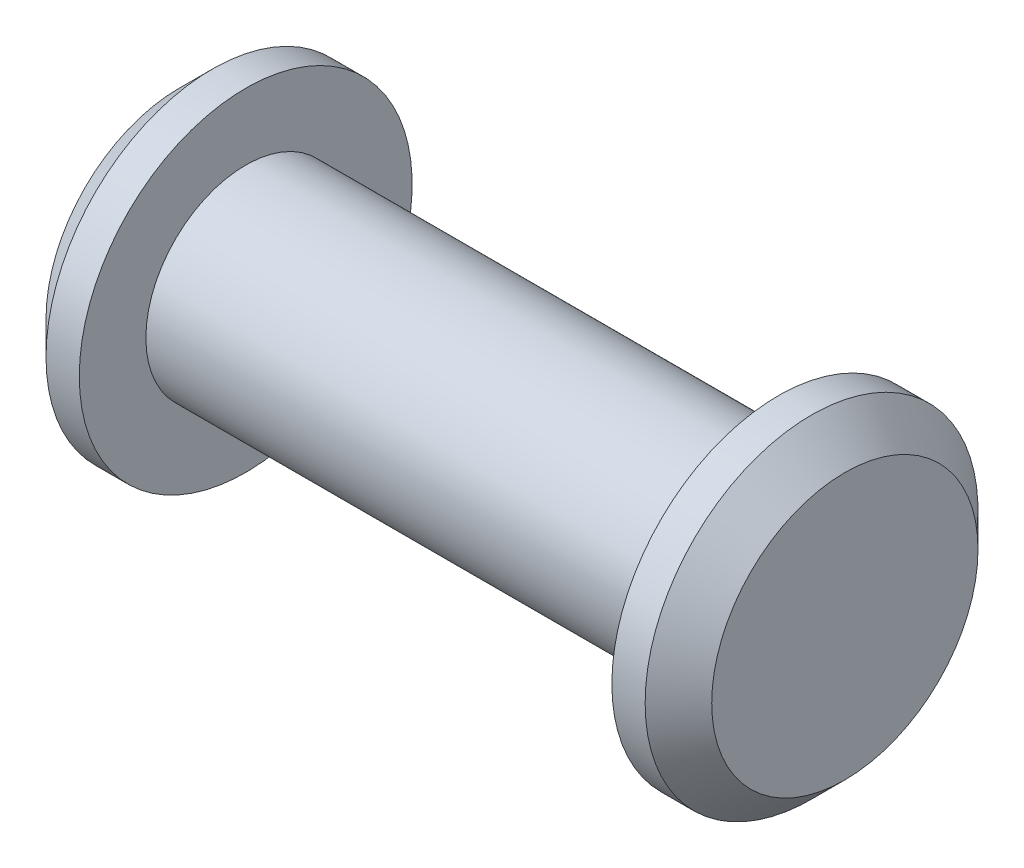
ISO-10303-21;
HEADER;
FILE_DESCRIPTION(('STEP AP214'),'2;1');
FILE_NAME('part.step','',(''),(''),'','','');
FILE_SCHEMA(('AUTOMOTIVE_DESIGN { 1 0 10303 214 1 1 1 1 }'));
ENDSEC;
DATA;
#1=APPLICATION_CONTEXT('core data for automotive mechanical design processes');
#2=APPLICATION_PROTOCOL_DEFINITION('international standard','automotive_design',2000,#1);
#3=PRODUCT_CONTEXT('',#1,'mechanical');
#4=PRODUCT('Part','Part','',(#3));
#5=PRODUCT_RELATED_PRODUCT_CATEGORY('part','',(#4));
#6=PRODUCT_DEFINITION_FORMATION('','',#4);
#7=PRODUCT_DEFINITION_CONTEXT('part definition',#1,'design');
#8=PRODUCT_DEFINITION('design','',#6,#7);
#9=PRODUCT_DEFINITION_SHAPE('','',#8);
#10=(LENGTH_UNIT() NAMED_UNIT(*) SI_UNIT(.MILLI.,.METRE.));
#11=(NAMED_UNIT(*) PLANE_ANGLE_UNIT() SI_UNIT($,.RADIAN.));
#12=(NAMED_UNIT(*) SI_UNIT($,.STERADIAN.) SOLID_ANGLE_UNIT());
#13=UNCERTAINTY_MEASURE_WITH_UNIT(LENGTH_MEASURE(1.E-05),#10,'distance_accuracy_value','');
#14=(GEOMETRIC_REPRESENTATION_CONTEXT(3) GLOBAL_UNCERTAINTY_ASSIGNED_CONTEXT((#13)) GLOBAL_UNIT_ASSIGNED_CONTEXT((#10,
#11,#12)) REPRESENTATION_CONTEXT('',''));
#15=CARTESIAN_POINT('',(0.,0.,0.));
#16=DIRECTION('',(0.,0.,1.));
#17=DIRECTION('',(1.,0.,0.));
#18=AXIS2_PLACEMENT_3D('',#15,#16,#17);
#19=CARTESIAN_POINT('',(-20.,0.,0.));
#20=DIRECTION('',(1.,0.,0.));
#21=DIRECTION('',(0.,0.,-1.));
#22=AXIS2_PLACEMENT_3D('',#19,#20,#21);
#23=PLANE('',#22);
#24=CARTESIAN_POINT('',(-20.,0.,0.));
#25=DIRECTION('',(-1.,0.,0.));
#26=DIRECTION('',(0.,0.,1.));
#27=AXIS2_PLACEMENT_3D('',#24,#25,#26);
#28=CIRCLE('',#27,8.);
#29=CARTESIAN_POINT('',(-20.,0.,8.));
#30=VERTEX_POINT('',#29);
#31=EDGE_CURVE('E10',#30,#30,#28,.T.);
#32=ORIENTED_EDGE('',*,*,#31,.T.);
#33=EDGE_LOOP('',(#32));
#34=FACE_BOUND('',#33,.T.);
#35=ADVANCED_FACE('F41',(#34),#23,.F.);
#36=CARTESIAN_POINT('',(-18.,0.,0.));
#37=DIRECTION('',(1.,0.,0.));
#38=DIRECTION('',(0.,0.,-1.));
#39=AXIS2_PLACEMENT_3D('',#36,#37,#38);
#40=CONICAL_SURFACE('',#39,10.,0.785398163397449);
#41=ORIENTED_EDGE('',*,*,#31,.F.);
#42=EDGE_LOOP('',(#41));
#43=FACE_BOUND('',#42,.T.);
#44=CARTESIAN_POINT('',(-18.,0.,0.));
#45=DIRECTION('',(-1.,0.,0.));
#46=DIRECTION('',(0.,0.,1.));
#47=AXIS2_PLACEMENT_3D('',#44,#45,#46);
#48=CIRCLE('',#47,10.);
#49=CARTESIAN_POINT('',(-18.,0.,10.));
#50=VERTEX_POINT('',#49);
#51=EDGE_CURVE('E47',#50,#50,#48,.T.);
#52=ORIENTED_EDGE('',*,*,#51,.T.);
#53=EDGE_LOOP('',(#52));
#54=FACE_BOUND('',#53,.T.);
#55=ADVANCED_FACE('F85',(#43,#54),#40,.T.);
#56=CARTESIAN_POINT('',(0.,0.,0.));
#57=DIRECTION('',(-1.,0.,0.));
#58=DIRECTION('',(0.,0.,1.));
#59=AXIS2_PLACEMENT_3D('',#56,#57,#58);
#60=CYLINDRICAL_SURFACE('',#59,10.);
#61=ORIENTED_EDGE('',*,*,#51,.F.);
#62=EDGE_LOOP('',(#61));
#63=FACE_BOUND('',#62,.T.);
#64=CARTESIAN_POINT('',(-16.,0.,0.));
#65=DIRECTION('',(-1.,0.,0.));
#66=DIRECTION('',(0.,0.,1.));
#67=AXIS2_PLACEMENT_3D('',#64,#65,#66);
#68=CIRCLE('',#67,10.);
#69=CARTESIAN_POINT('',(-16.,0.,10.));
#70=VERTEX_POINT('',#69);
#71=EDGE_CURVE('E51',#70,#70,#68,.T.);
#72=ORIENTED_EDGE('',*,*,#71,.T.);
#73=EDGE_LOOP('',(#72));
#74=FACE_BOUND('',#73,.T.);
#75=ADVANCED_FACE('F89',(#63,#74),#60,.T.);
#76=CARTESIAN_POINT('',(-16.,10.,0.));
#77=DIRECTION('',(-1.,0.,0.));
#78=DIRECTION('',(0.,0.,1.));
#79=AXIS2_PLACEMENT_3D('',#76,#77,#78);
#80=PLANE('',#79);
#81=ORIENTED_EDGE('',*,*,#71,.F.);
#82=EDGE_LOOP('',(#81));
#83=FACE_BOUND('',#82,.T.);
#84=CARTESIAN_POINT('',(-16.,0.,0.));
#85=DIRECTION('',(-1.,0.,0.));
#86=DIRECTION('',(0.,0.,1.));
#87=AXIS2_PLACEMENT_3D('',#84,#85,#86);
#88=CIRCLE('',#87,6.);
#89=CARTESIAN_POINT('',(-16.,0.,6.));
#90=VERTEX_POINT('',#89);
#91=EDGE_CURVE('E55',#90,#90,#88,.T.);
#92=ORIENTED_EDGE('',*,*,#91,.T.);
#93=EDGE_LOOP('',(#92));
#94=FACE_BOUND('',#93,.T.);
#95=ADVANCED_FACE('F94',(#83,#94),#80,.F.);
#96=CARTESIAN_POINT('',(0.,0.,0.));
#97=DIRECTION('',(-1.,0.,0.));
#98=DIRECTION('',(0.,0.,1.));
#99=AXIS2_PLACEMENT_3D('',#96,#97,#98);
#100=CYLINDRICAL_SURFACE('',#99,6.);
#101=ORIENTED_EDGE('',*,*,#91,.F.);
#102=EDGE_LOOP('',(#101));
#103=FACE_BOUND('',#102,.T.);
#104=CARTESIAN_POINT('',(16.,0.,0.));
#105=DIRECTION('',(-1.,0.,0.));
#106=DIRECTION('',(0.,0.,1.));
#107=AXIS2_PLACEMENT_3D('',#104,#105,#106);
#108=CIRCLE('',#107,6.);
#109=CARTESIAN_POINT('',(16.,0.,6.));
#110=VERTEX_POINT('',#109);
#111=EDGE_CURVE('E60',#110,#110,#108,.T.);
#112=ORIENTED_EDGE('',*,*,#111,.T.);
#113=EDGE_LOOP('',(#112));
#114=FACE_BOUND('',#113,.T.);
#115=ADVANCED_FACE('F100',(#103,#114),#100,.T.);
#116=CARTESIAN_POINT('',(16.,6.,0.));
#117=DIRECTION('',(1.,0.,0.));
#118=DIRECTION('',(0.,0.,-1.));
#119=AXIS2_PLACEMENT_3D('',#116,#117,#118);
#120=PLANE('',#119);
#121=ORIENTED_EDGE('',*,*,#111,.F.);
#122=EDGE_LOOP('',(#121));
#123=FACE_BOUND('',#122,.T.);
#124=CARTESIAN_POINT('',(16.,0.,0.));
#125=DIRECTION('',(-1.,0.,0.));
#126=DIRECTION('',(0.,0.,1.));
#127=AXIS2_PLACEMENT_3D('',#124,#125,#126);
#128=CIRCLE('',#127,10.);
#129=CARTESIAN_POINT('',(16.,0.,10.));
#130=VERTEX_POINT('',#129);
#131=EDGE_CURVE('E63',#130,#130,#128,.T.);
#132=ORIENTED_EDGE('',*,*,#131,.T.);
#133=EDGE_LOOP('',(#132));
#134=FACE_BOUND('',#133,.T.);
#135=ADVANCED_FACE('F104',(#123,#134),#120,.F.);
#136=CARTESIAN_POINT('',(0.,0.,0.));
#137=DIRECTION('',(-1.,0.,0.));
#138=DIRECTION('',(0.,0.,1.));
#139=AXIS2_PLACEMENT_3D('',#136,#137,#138);
#140=CYLINDRICAL_SURFACE('',#139,10.);
#141=ORIENTED_EDGE('',*,*,#131,.F.);
#142=EDGE_LOOP('',(#141));
#143=FACE_BOUND('',#142,.T.);
#144=CARTESIAN_POINT('',(18.,0.,0.));
#145=DIRECTION('',(-1.,0.,0.));
#146=DIRECTION('',(0.,0.,1.));
#147=AXIS2_PLACEMENT_3D('',#144,#145,#146);
#148=CIRCLE('',#147,10.);
#149=CARTESIAN_POINT('',(18.,0.,10.));
#150=VERTEX_POINT('',#149);
#151=EDGE_CURVE('E66',#150,#150,#148,.T.);
#152=ORIENTED_EDGE('',*,*,#151,.T.);
#153=EDGE_LOOP('',(#152));
#154=FACE_BOUND('',#153,.T.);
#155=ADVANCED_FACE('F81',(#143,#154),#140,.T.);
#156=CARTESIAN_POINT('',(20.,0.,0.));
#157=DIRECTION('',(-1.,0.,0.));
#158=DIRECTION('',(0.,0.,1.));
#159=AXIS2_PLACEMENT_3D('',#156,#157,#158);
#160=CONICAL_SURFACE('',#159,8.00000000000001,0.785398163397447);
#161=ORIENTED_EDGE('',*,*,#151,.F.);
#162=EDGE_LOOP('',(#161));
#163=FACE_BOUND('',#162,.T.);
#164=CARTESIAN_POINT('',(20.,0.,0.));
#165=DIRECTION('',(-1.,0.,0.));
#166=DIRECTION('',(0.,0.,1.));
#167=AXIS2_PLACEMENT_3D('',#164,#165,#166);
#168=CIRCLE('',#167,8.00000000000001);
#169=CARTESIAN_POINT('',(20.,0.,8.00000000000001));
#170=VERTEX_POINT('',#169);
#171=EDGE_CURVE('E69',#170,#170,#168,.T.);
#172=ORIENTED_EDGE('',*,*,#171,.T.);
#173=EDGE_LOOP('',(#172));
#174=FACE_BOUND('',#173,.T.);
#175=ADVANCED_FACE('F73',(#163,#174),#160,.T.);
#176=CARTESIAN_POINT('',(20.,8.00000000000001,0.));
#177=DIRECTION('',(-1.,0.,0.));
#178=DIRECTION('',(0.,0.,1.));
#179=AXIS2_PLACEMENT_3D('',#176,#177,#178);
#180=PLANE('',#179);
#181=ORIENTED_EDGE('',*,*,#171,.F.);
#182=EDGE_LOOP('',(#181));
#183=FACE_BOUND('',#182,.T.);
#184=ADVANCED_FACE('F75',(#183),#180,.F.);
#185=CLOSED_SHELL('',(#35,#55,#75,#95,#115,#135,#155,#175,#184));
#186=MANIFOLD_SOLID_BREP('B2',#185);
#187=ADVANCED_BREP_SHAPE_REPRESENTATION('',(#18,#186),#14);
#188=SHAPE_DEFINITION_REPRESENTATION(#9,#187);
ENDSEC;
END-ISO-10303-21;
